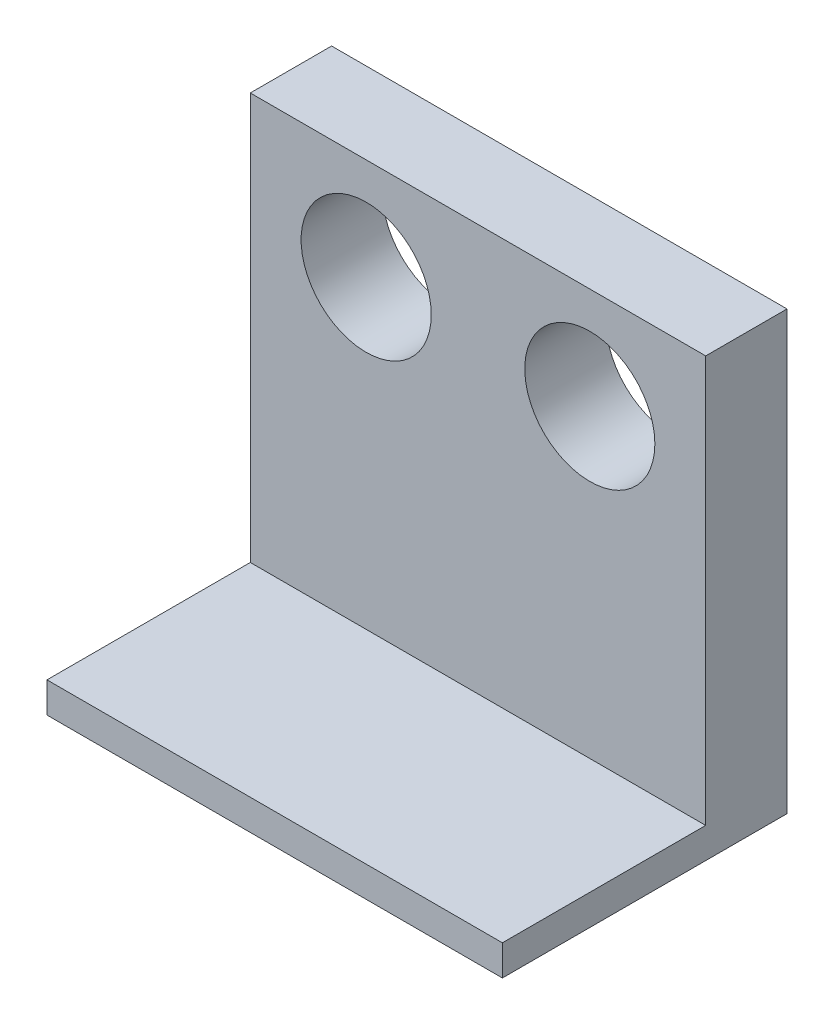
ISO-10303-21;
HEADER;
FILE_DESCRIPTION(('STEP AP214'),'2;1');
FILE_NAME('part.step','',(''),(''),'','','');
FILE_SCHEMA(('AUTOMOTIVE_DESIGN { 1 0 10303 214 1 1 1 1 }'));
ENDSEC;
DATA;
#1=APPLICATION_CONTEXT('core data for automotive mechanical design processes');
#2=APPLICATION_PROTOCOL_DEFINITION('international standard','automotive_design',2000,#1);
#3=PRODUCT_CONTEXT('',#1,'mechanical');
#4=PRODUCT('Part','Part','',(#3));
#5=PRODUCT_RELATED_PRODUCT_CATEGORY('part','',(#4));
#6=PRODUCT_DEFINITION_FORMATION('','',#4);
#7=PRODUCT_DEFINITION_CONTEXT('part definition',#1,'design');
#8=PRODUCT_DEFINITION('design','',#6,#7);
#9=PRODUCT_DEFINITION_SHAPE('','',#8);
#10=(LENGTH_UNIT() NAMED_UNIT(*) SI_UNIT(.MILLI.,.METRE.));
#11=(NAMED_UNIT(*) PLANE_ANGLE_UNIT() SI_UNIT($,.RADIAN.));
#12=(NAMED_UNIT(*) SI_UNIT($,.STERADIAN.) SOLID_ANGLE_UNIT());
#13=UNCERTAINTY_MEASURE_WITH_UNIT(LENGTH_MEASURE(1.E-05),#10,'distance_accuracy_value','');
#14=(GEOMETRIC_REPRESENTATION_CONTEXT(3) GLOBAL_UNCERTAINTY_ASSIGNED_CONTEXT((#13)) GLOBAL_UNIT_ASSIGNED_CONTEXT((#10,
#11,#12)) REPRESENTATION_CONTEXT('',''));
#15=CARTESIAN_POINT('',(0.,0.,0.));
#16=DIRECTION('',(0.,0.,1.));
#17=DIRECTION('',(1.,0.,0.));
#18=AXIS2_PLACEMENT_3D('',#15,#16,#17);
#19=CARTESIAN_POINT('',(0.,0.,8.));
#20=DIRECTION('',(0.,0.,-1.));
#21=DIRECTION('',(-1.,0.,0.));
#22=AXIS2_PLACEMENT_3D('',#19,#20,#21);
#23=PLANE('',#22);
#24=CARTESIAN_POINT('',(11.,11.5,8.));
#25=DIRECTION('',(0.,0.,1.));
#26=DIRECTION('',(1.,0.,0.));
#27=AXIS2_PLACEMENT_3D('',#24,#25,#26);
#28=CIRCLE('',#27,6.4);
#29=CARTESIAN_POINT('',(17.4,11.5,8.));
#30=VERTEX_POINT('',#29);
#31=EDGE_CURVE('E140',#30,#30,#28,.T.);
#32=ORIENTED_EDGE('',*,*,#31,.F.);
#33=EDGE_LOOP('',(#32));
#34=FACE_BOUND('',#33,.T.);
#35=CARTESIAN_POINT('',(-11.,11.5,8.));
#36=DIRECTION('',(0.,0.,1.));
#37=DIRECTION('',(1.,0.,0.));
#38=AXIS2_PLACEMENT_3D('',#35,#36,#37);
#39=CIRCLE('',#38,6.4);
#40=CARTESIAN_POINT('',(-4.6,11.5,8.));
#41=VERTEX_POINT('',#40);
#42=EDGE_CURVE('E108',#41,#41,#39,.T.);
#43=ORIENTED_EDGE('',*,*,#42,.F.);
#44=EDGE_LOOP('',(#43));
#45=FACE_BOUND('',#44,.T.);
#46=DIRECTION('',(-1.,0.,0.));
#47=VECTOR('',#46,1.);
#48=CARTESIAN_POINT('',(-22.4,-18.5,8.));
#49=LINE('',#48,#47);
#50=CARTESIAN_POINT('',(22.4,-18.5,8.));
#51=VERTEX_POINT('',#50);
#52=CARTESIAN_POINT('',(-22.4,-18.5,8.));
#53=VERTEX_POINT('',#52);
#54=EDGE_CURVE('E54',#51,#53,#49,.T.);
#55=ORIENTED_EDGE('',*,*,#54,.F.);
#56=DIRECTION('',(0.,1.,0.));
#57=VECTOR('',#56,1.);
#58=CARTESIAN_POINT('',(22.4,-21.5,8.));
#59=LINE('',#58,#57);
#60=CARTESIAN_POINT('',(22.4,21.5,8.));
#61=VERTEX_POINT('',#60);
#62=EDGE_CURVE('E92',#51,#61,#59,.T.);
#63=ORIENTED_EDGE('',*,*,#62,.T.);
#64=DIRECTION('',(-1.,0.,0.));
#65=VECTOR('',#64,1.);
#66=CARTESIAN_POINT('',(-22.4,21.5,8.));
#67=LINE('',#66,#65);
#68=CARTESIAN_POINT('',(-22.4,21.5,8.));
#69=VERTEX_POINT('',#68);
#70=EDGE_CURVE('E60',#61,#69,#67,.T.);
#71=ORIENTED_EDGE('',*,*,#70,.T.);
#72=DIRECTION('',(0.,-1.,0.));
#73=VECTOR('',#72,1.);
#74=CARTESIAN_POINT('',(-22.4,-21.5,8.));
#75=LINE('',#74,#73);
#76=EDGE_CURVE('E103',#69,#53,#75,.T.);
#77=ORIENTED_EDGE('',*,*,#76,.T.);
#78=EDGE_LOOP('',(#55,#63,#71,#77));
#79=FACE_BOUND('',#78,.T.);
#80=ADVANCED_FACE('F39',(#34,#45,#79),#23,.F.);
#81=CARTESIAN_POINT('',(0.,0.,0.));
#82=DIRECTION('',(0.,0.,-1.));
#83=DIRECTION('',(-1.,0.,0.));
#84=AXIS2_PLACEMENT_3D('',#81,#82,#83);
#85=PLANE('',#84);
#86=CARTESIAN_POINT('',(-11.,11.5,0.));
#87=DIRECTION('',(0.,0.,1.));
#88=DIRECTION('',(1.,0.,0.));
#89=AXIS2_PLACEMENT_3D('',#86,#87,#88);
#90=CIRCLE('',#89,6.4);
#91=CARTESIAN_POINT('',(-4.6,11.5,0.));
#92=VERTEX_POINT('',#91);
#93=EDGE_CURVE('E112',#92,#92,#90,.T.);
#94=ORIENTED_EDGE('',*,*,#93,.T.);
#95=EDGE_LOOP('',(#94));
#96=FACE_BOUND('',#95,.T.);
#97=DIRECTION('',(0.,1.,0.));
#98=VECTOR('',#97,1.);
#99=CARTESIAN_POINT('',(22.4,-21.5,0.));
#100=LINE('',#99,#98);
#101=CARTESIAN_POINT('',(22.4,-21.5,0.));
#102=VERTEX_POINT('',#101);
#103=CARTESIAN_POINT('',(22.4,21.5,0.));
#104=VERTEX_POINT('',#103);
#105=EDGE_CURVE('E99',#102,#104,#100,.T.);
#106=ORIENTED_EDGE('',*,*,#105,.F.);
#107=DIRECTION('',(1.,0.,0.));
#108=VECTOR('',#107,1.);
#109=CARTESIAN_POINT('',(-22.4,-21.5,0.));
#110=LINE('',#109,#108);
#111=CARTESIAN_POINT('',(-22.4,-21.5,0.));
#112=VERTEX_POINT('',#111);
#113=EDGE_CURVE('E80',#112,#102,#110,.T.);
#114=ORIENTED_EDGE('',*,*,#113,.F.);
#115=DIRECTION('',(0.,-1.,0.));
#116=VECTOR('',#115,1.);
#117=CARTESIAN_POINT('',(-22.4,-21.5,0.));
#118=LINE('',#117,#116);
#119=CARTESIAN_POINT('',(-22.4,21.5,0.));
#120=VERTEX_POINT('',#119);
#121=EDGE_CURVE('E93',#120,#112,#118,.T.);
#122=ORIENTED_EDGE('',*,*,#121,.F.);
#123=DIRECTION('',(-1.,0.,0.));
#124=VECTOR('',#123,1.);
#125=CARTESIAN_POINT('',(-22.4,21.5,0.));
#126=LINE('',#125,#124);
#127=EDGE_CURVE('E107',#104,#120,#126,.T.);
#128=ORIENTED_EDGE('',*,*,#127,.F.);
#129=EDGE_LOOP('',(#106,#114,#122,#128));
#130=FACE_BOUND('',#129,.T.);
#131=CARTESIAN_POINT('',(11.,11.5,0.));
#132=DIRECTION('',(0.,0.,1.));
#133=DIRECTION('',(1.,0.,0.));
#134=AXIS2_PLACEMENT_3D('',#131,#132,#133);
#135=CIRCLE('',#134,6.4);
#136=CARTESIAN_POINT('',(17.4,11.5,0.));
#137=VERTEX_POINT('',#136);
#138=EDGE_CURVE('E136',#137,#137,#135,.T.);
#139=ORIENTED_EDGE('',*,*,#138,.T.);
#140=EDGE_LOOP('',(#139));
#141=FACE_BOUND('',#140,.T.);
#142=ADVANCED_FACE('F105',(#96,#130,#141),#85,.T.);
#143=CARTESIAN_POINT('',(22.4,-21.5,8.));
#144=DIRECTION('',(-1.,0.,0.));
#145=DIRECTION('',(0.,0.,1.));
#146=AXIS2_PLACEMENT_3D('',#143,#144,#145);
#147=PLANE('',#146);
#148=ORIENTED_EDGE('',*,*,#105,.T.);
#149=DIRECTION('',(0.,0.,-1.));
#150=VECTOR('',#149,1.);
#151=CARTESIAN_POINT('',(22.4,21.5,8.));
#152=LINE('',#151,#150);
#153=EDGE_CURVE('E11',#61,#104,#152,.T.);
#154=ORIENTED_EDGE('',*,*,#153,.F.);
#155=ORIENTED_EDGE('',*,*,#62,.F.);
#156=DIRECTION('',(0.,0.,-1.));
#157=VECTOR('',#156,1.);
#158=CARTESIAN_POINT('',(22.4,-18.5,28.));
#159=LINE('',#158,#157);
#160=CARTESIAN_POINT('',(22.4,-18.5,28.));
#161=VERTEX_POINT('',#160);
#162=EDGE_CURVE('E127',#161,#51,#159,.T.);
#163=ORIENTED_EDGE('',*,*,#162,.F.);
#164=DIRECTION('',(0.,1.,0.));
#165=VECTOR('',#164,1.);
#166=CARTESIAN_POINT('',(22.4,-21.5,28.));
#167=LINE('',#166,#165);
#168=CARTESIAN_POINT('',(22.4,-21.5,28.));
#169=VERTEX_POINT('',#168);
#170=EDGE_CURVE('E102',#169,#161,#167,.T.);
#171=ORIENTED_EDGE('',*,*,#170,.F.);
#172=DIRECTION('',(0.,0.,-1.));
#173=VECTOR('',#172,1.);
#174=CARTESIAN_POINT('',(22.4,-21.5,8.));
#175=LINE('',#174,#173);
#176=EDGE_CURVE('E85',#169,#102,#175,.T.);
#177=ORIENTED_EDGE('',*,*,#176,.T.);
#178=EDGE_LOOP('',(#148,#154,#155,#163,#171,#177));
#179=FACE_BOUND('',#178,.T.);
#180=ADVANCED_FACE('F41',(#179),#147,.F.);
#181=CARTESIAN_POINT('',(-22.4,21.5,8.));
#182=DIRECTION('',(0.,-1.,0.));
#183=DIRECTION('',(0.,0.,-1.));
#184=AXIS2_PLACEMENT_3D('',#181,#182,#183);
#185=PLANE('',#184);
#186=ORIENTED_EDGE('',*,*,#127,.T.);
#187=DIRECTION('',(0.,0.,-1.));
#188=VECTOR('',#187,1.);
#189=CARTESIAN_POINT('',(-22.4,21.5,8.));
#190=LINE('',#189,#188);
#191=EDGE_CURVE('E47',#69,#120,#190,.T.);
#192=ORIENTED_EDGE('',*,*,#191,.F.);
#193=ORIENTED_EDGE('',*,*,#70,.F.);
#194=ORIENTED_EDGE('',*,*,#153,.T.);
#195=EDGE_LOOP('',(#186,#192,#193,#194));
#196=FACE_BOUND('',#195,.T.);
#197=ADVANCED_FACE('F124',(#196),#185,.F.);
#198=CARTESIAN_POINT('',(-22.4,-21.5,8.));
#199=DIRECTION('',(1.,0.,0.));
#200=DIRECTION('',(0.,0.,-1.));
#201=AXIS2_PLACEMENT_3D('',#198,#199,#200);
#202=PLANE('',#201);
#203=ORIENTED_EDGE('',*,*,#121,.T.);
#204=DIRECTION('',(0.,0.,-1.));
#205=VECTOR('',#204,1.);
#206=CARTESIAN_POINT('',(-22.4,-21.5,8.));
#207=LINE('',#206,#205);
#208=CARTESIAN_POINT('',(-22.4,-21.5,28.));
#209=VERTEX_POINT('',#208);
#210=EDGE_CURVE('E88',#209,#112,#207,.T.);
#211=ORIENTED_EDGE('',*,*,#210,.F.);
#212=DIRECTION('',(0.,-1.,0.));
#213=VECTOR('',#212,1.);
#214=CARTESIAN_POINT('',(-22.4,-21.5,28.));
#215=LINE('',#214,#213);
#216=CARTESIAN_POINT('',(-22.4,-18.5,28.));
#217=VERTEX_POINT('',#216);
#218=EDGE_CURVE('E159',#217,#209,#215,.T.);
#219=ORIENTED_EDGE('',*,*,#218,.F.);
#220=DIRECTION('',(0.,0.,-1.));
#221=VECTOR('',#220,1.);
#222=CARTESIAN_POINT('',(-22.4,-18.5,28.));
#223=LINE('',#222,#221);
#224=EDGE_CURVE('E137',#217,#53,#223,.T.);
#225=ORIENTED_EDGE('',*,*,#224,.T.);
#226=ORIENTED_EDGE('',*,*,#76,.F.);
#227=ORIENTED_EDGE('',*,*,#191,.T.);
#228=EDGE_LOOP('',(#203,#211,#219,#225,#226,#227));
#229=FACE_BOUND('',#228,.T.);
#230=ADVANCED_FACE('F121',(#229),#202,.F.);
#231=CARTESIAN_POINT('',(-22.4,-21.5,8.));
#232=DIRECTION('',(0.,1.,0.));
#233=DIRECTION('',(0.,0.,1.));
#234=AXIS2_PLACEMENT_3D('',#231,#232,#233);
#235=PLANE('',#234);
#236=ORIENTED_EDGE('',*,*,#113,.T.);
#237=ORIENTED_EDGE('',*,*,#176,.F.);
#238=DIRECTION('',(1.,0.,0.));
#239=VECTOR('',#238,1.);
#240=CARTESIAN_POINT('',(-22.4,-21.5,28.));
#241=LINE('',#240,#239);
#242=EDGE_CURVE('E156',#209,#169,#241,.T.);
#243=ORIENTED_EDGE('',*,*,#242,.F.);
#244=ORIENTED_EDGE('',*,*,#210,.T.);
#245=EDGE_LOOP('',(#236,#237,#243,#244));
#246=FACE_BOUND('',#245,.T.);
#247=ADVANCED_FACE('F82',(#246),#235,.F.);
#248=CARTESIAN_POINT('',(-11.,11.5,8.));
#249=DIRECTION('',(0.,0.,-1.));
#250=DIRECTION('',(-1.,0.,0.));
#251=AXIS2_PLACEMENT_3D('',#248,#249,#250);
#252=CYLINDRICAL_SURFACE('',#251,6.4);
#253=ORIENTED_EDGE('',*,*,#42,.T.);
#254=EDGE_LOOP('',(#253));
#255=FACE_BOUND('',#254,.T.);
#256=ORIENTED_EDGE('',*,*,#93,.F.);
#257=EDGE_LOOP('',(#256));
#258=FACE_BOUND('',#257,.T.);
#259=ADVANCED_FACE('F183',(#255,#258),#252,.F.);
#260=CARTESIAN_POINT('',(11.,11.5,8.));
#261=DIRECTION('',(0.,0.,-1.));
#262=DIRECTION('',(-1.,0.,0.));
#263=AXIS2_PLACEMENT_3D('',#260,#261,#262);
#264=CYLINDRICAL_SURFACE('',#263,6.4);
#265=ORIENTED_EDGE('',*,*,#31,.T.);
#266=EDGE_LOOP('',(#265));
#267=FACE_BOUND('',#266,.T.);
#268=ORIENTED_EDGE('',*,*,#138,.F.);
#269=EDGE_LOOP('',(#268));
#270=FACE_BOUND('',#269,.T.);
#271=ADVANCED_FACE('F168',(#267,#270),#264,.F.);
#272=CARTESIAN_POINT('',(-22.4,-18.5,28.));
#273=DIRECTION('',(0.,-1.,0.));
#274=DIRECTION('',(0.,0.,-1.));
#275=AXIS2_PLACEMENT_3D('',#272,#273,#274);
#276=PLANE('',#275);
#277=ORIENTED_EDGE('',*,*,#54,.T.);
#278=ORIENTED_EDGE('',*,*,#224,.F.);
#279=DIRECTION('',(-1.,0.,0.));
#280=VECTOR('',#279,1.);
#281=CARTESIAN_POINT('',(-22.4,-18.5,28.));
#282=LINE('',#281,#280);
#283=EDGE_CURVE('E135',#161,#217,#282,.T.);
#284=ORIENTED_EDGE('',*,*,#283,.F.);
#285=ORIENTED_EDGE('',*,*,#162,.T.);
#286=EDGE_LOOP('',(#277,#278,#284,#285));
#287=FACE_BOUND('',#286,.T.);
#288=ADVANCED_FACE('F131',(#287),#276,.F.);
#289=CARTESIAN_POINT('',(0.,0.,28.));
#290=DIRECTION('',(0.,0.,-1.));
#291=DIRECTION('',(-1.,0.,0.));
#292=AXIS2_PLACEMENT_3D('',#289,#290,#291);
#293=PLANE('',#292);
#294=ORIENTED_EDGE('',*,*,#218,.T.);
#295=ORIENTED_EDGE('',*,*,#242,.T.);
#296=ORIENTED_EDGE('',*,*,#170,.T.);
#297=ORIENTED_EDGE('',*,*,#283,.T.);
#298=EDGE_LOOP('',(#294,#295,#296,#297));
#299=FACE_BOUND('',#298,.T.);
#300=ADVANCED_FACE('F155',(#299),#293,.F.);
#301=CLOSED_SHELL('',(#80,#142,#180,#197,#230,#247,#259,#271,#288,#300));
#302=MANIFOLD_SOLID_BREP('B2',#301);
#303=ADVANCED_BREP_SHAPE_REPRESENTATION('',(#18,#302),#14);
#304=SHAPE_DEFINITION_REPRESENTATION(#9,#303);
ENDSEC;
END-ISO-10303-21;
